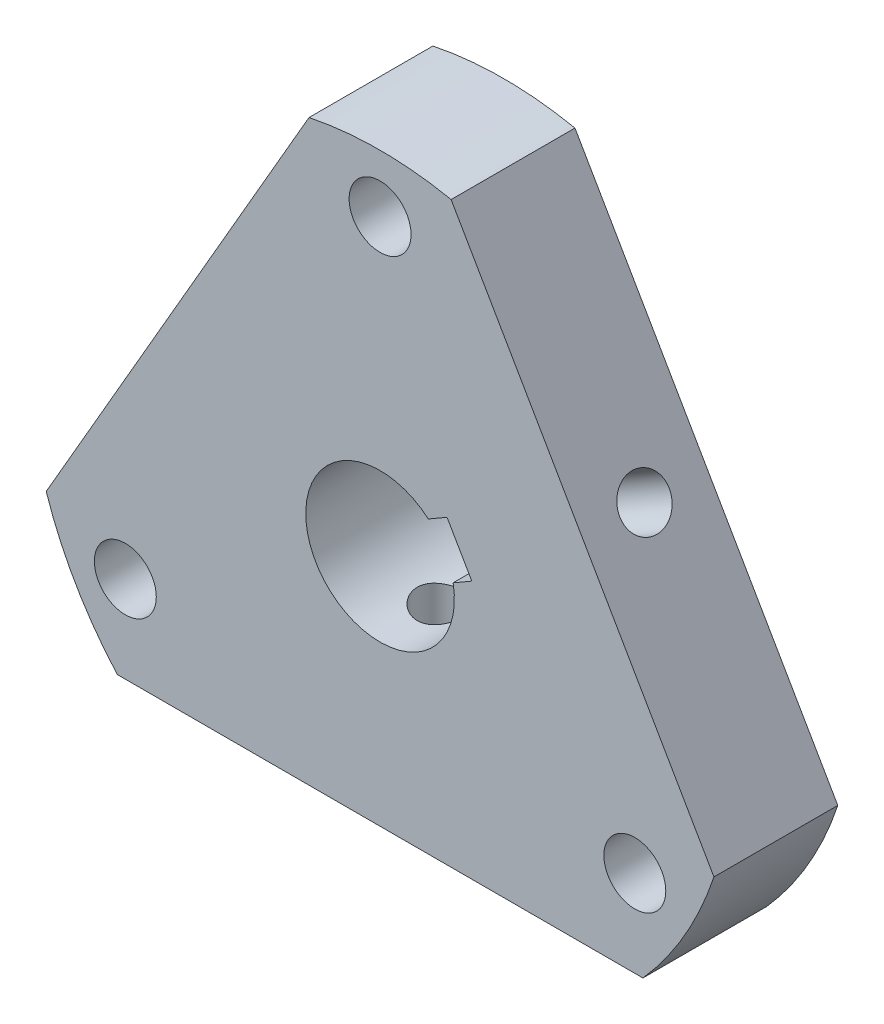
ISO-10303-21;
HEADER;
FILE_DESCRIPTION(('STEP AP214'),'2;1');
FILE_NAME('part.step','',(''),(''),'','','');
FILE_SCHEMA(('AUTOMOTIVE_DESIGN { 1 0 10303 214 1 1 1 1 }'));
ENDSEC;
DATA;
#1=APPLICATION_CONTEXT('core data for automotive mechanical design processes');
#2=APPLICATION_PROTOCOL_DEFINITION('international standard','automotive_design',2000,#1);
#3=PRODUCT_CONTEXT('',#1,'mechanical');
#4=PRODUCT('Part','Part','',(#3));
#5=PRODUCT_RELATED_PRODUCT_CATEGORY('part','',(#4));
#6=PRODUCT_DEFINITION_FORMATION('','',#4);
#7=PRODUCT_DEFINITION_CONTEXT('part definition',#1,'design');
#8=PRODUCT_DEFINITION('design','',#6,#7);
#9=PRODUCT_DEFINITION_SHAPE('','',#8);
#10=(LENGTH_UNIT() NAMED_UNIT(*) SI_UNIT(.MILLI.,.METRE.));
#11=(NAMED_UNIT(*) PLANE_ANGLE_UNIT() SI_UNIT($,.RADIAN.));
#12=(NAMED_UNIT(*) SI_UNIT($,.STERADIAN.) SOLID_ANGLE_UNIT());
#13=UNCERTAINTY_MEASURE_WITH_UNIT(LENGTH_MEASURE(1.E-05),#10,'distance_accuracy_value','');
#14=(GEOMETRIC_REPRESENTATION_CONTEXT(3) GLOBAL_UNCERTAINTY_ASSIGNED_CONTEXT((#13)) GLOBAL_UNIT_ASSIGNED_CONTEXT((#10,
#11,#12)) REPRESENTATION_CONTEXT('',''));
#15=CARTESIAN_POINT('',(0.,0.,0.));
#16=DIRECTION('',(0.,0.,1.));
#17=DIRECTION('',(1.,0.,0.));
#18=AXIS2_PLACEMENT_3D('',#15,#16,#17);
#19=CARTESIAN_POINT('',(6.40858798800485,3.7,10.));
#20=DIRECTION('',(0.866025403784439,0.5,0.));
#21=DIRECTION('',(-0.5,0.866025403784439,0.));
#22=AXIS2_PLACEMENT_3D('',#19,#20,#21);
#23=PLANE('',#22);
#24=DIRECTION('',(0.,0.,-1.));
#25=VECTOR('',#24,1.);
#26=CARTESIAN_POINT('',(5.40858798800485,5.43205080756888,10.));
#27=LINE('',#26,#25);
#28=CARTESIAN_POINT('',(5.40858798800485,5.43205080756888,10.));
#29=VERTEX_POINT('',#28);
#30=CARTESIAN_POINT('',(5.40858798800485,5.43205080756888,5.));
#31=VERTEX_POINT('',#30);
#32=EDGE_CURVE('E203',#29,#31,#27,.T.);
#33=ORIENTED_EDGE('',*,*,#32,.T.);
#34=CARTESIAN_POINT('',(6.40858798800485,3.7,5.));
#35=DIRECTION('',(0.866025403784439,0.5,0.));
#36=DIRECTION('',(-0.5,0.866025403784439,0.));
#37=AXIS2_PLACEMENT_3D('',#34,#35,#36);
#38=CIRCLE('',#37,2.);
#39=CARTESIAN_POINT('',(7.40858798800485,1.96794919243112,5.));
#40=VERTEX_POINT('',#39);
#41=EDGE_CURVE('E55',#31,#40,#38,.T.);
#42=ORIENTED_EDGE('',*,*,#41,.T.);
#43=DIRECTION('',(0.,0.,-1.));
#44=VECTOR('',#43,1.);
#45=CARTESIAN_POINT('',(7.40858798800485,1.96794919243112,10.));
#46=LINE('',#45,#44);
#47=CARTESIAN_POINT('',(7.40858798800485,1.96794919243112,10.));
#48=VERTEX_POINT('',#47);
#49=EDGE_CURVE('E199',#48,#40,#46,.T.);
#50=ORIENTED_EDGE('',*,*,#49,.F.);
#51=DIRECTION('',(0.5,-0.866025403784439,0.));
#52=VECTOR('',#51,1.);
#53=CARTESIAN_POINT('',(6.40858798800485,3.7,10.));
#54=LINE('',#53,#52);
#55=EDGE_CURVE('E230',#29,#48,#54,.T.);
#56=ORIENTED_EDGE('',*,*,#55,.F.);
#57=EDGE_LOOP('',(#33,#42,#50,#56));
#58=FACE_BOUND('',#57,.T.);
#59=ADVANCED_FACE('F35',(#58),#23,.F.);
#60=CARTESIAN_POINT('',(16.3462294964313,9.43749999999999,10.));
#61=DIRECTION('',(-0.866025403784439,-0.5,0.));
#62=DIRECTION('',(0.5,-0.866025403784439,0.));
#63=AXIS2_PLACEMENT_3D('',#60,#61,#62);
#64=PLANE('',#63);
#65=CARTESIAN_POINT('',(16.3462294964313,9.4375,5.));
#66=DIRECTION('',(0.866025403784439,0.5,0.));
#67=DIRECTION('',(-0.5,0.866025403784439,0.));
#68=AXIS2_PLACEMENT_3D('',#65,#66,#67);
#69=CIRCLE('',#68,2.);
#70=CARTESIAN_POINT('',(15.3462294964313,11.1695508075689,5.));
#71=VERTEX_POINT('',#70);
#72=EDGE_CURVE('E259',#71,#71,#69,.T.);
#73=ORIENTED_EDGE('',*,*,#72,.F.);
#74=EDGE_LOOP('',(#73));
#75=FACE_BOUND('',#74,.T.);
#76=DIRECTION('',(-0.5,0.866025403784439,0.));
#77=VECTOR('',#76,1.);
#78=CARTESIAN_POINT('',(16.3462294964313,9.43749999999999,0.));
#79=LINE('',#78,#77);
#80=CARTESIAN_POINT('',(26.9562998896945,-8.93968099301414,0.));
#81=VERTEX_POINT('',#80);
#82=CARTESIAN_POINT('',(5.7361591031681,27.8146809930141,0.));
#83=VERTEX_POINT('',#82);
#84=EDGE_CURVE('E182',#81,#83,#79,.T.);
#85=ORIENTED_EDGE('',*,*,#84,.T.);
#86=DIRECTION('',(0.,0.,-1.));
#87=VECTOR('',#86,1.);
#88=CARTESIAN_POINT('',(5.7361591031681,27.8146809930141,10.));
#89=LINE('',#88,#87);
#90=CARTESIAN_POINT('',(5.7361591031681,27.8146809930141,10.));
#91=VERTEX_POINT('',#90);
#92=EDGE_CURVE('E11',#91,#83,#89,.T.);
#93=ORIENTED_EDGE('',*,*,#92,.F.);
#94=DIRECTION('',(-0.5,0.866025403784439,0.));
#95=VECTOR('',#94,1.);
#96=CARTESIAN_POINT('',(16.3462294964313,9.43749999999999,10.));
#97=LINE('',#96,#95);
#98=CARTESIAN_POINT('',(26.9562998896945,-8.93968099301414,10.));
#99=VERTEX_POINT('',#98);
#100=EDGE_CURVE('E246',#99,#91,#97,.T.);
#101=ORIENTED_EDGE('',*,*,#100,.F.);
#102=DIRECTION('',(0.,0.,-1.));
#103=VECTOR('',#102,1.);
#104=CARTESIAN_POINT('',(26.9562998896945,-8.93968099301414,10.));
#105=LINE('',#104,#103);
#106=EDGE_CURVE('E191',#99,#81,#105,.T.);
#107=ORIENTED_EDGE('',*,*,#106,.T.);
#108=EDGE_LOOP('',(#85,#93,#101,#107));
#109=FACE_BOUND('',#108,.T.);
#110=ADVANCED_FACE('F279',(#75,#109),#64,.F.);
#111=CARTESIAN_POINT('',(0.,0.,10.));
#112=DIRECTION('',(0.,0.,-1.));
#113=DIRECTION('',(-1.,0.,0.));
#114=AXIS2_PLACEMENT_3D('',#111,#112,#113);
#115=CYLINDRICAL_SURFACE('',#114,28.4);
#116=CARTESIAN_POINT('',(0.,0.,0.));
#117=DIRECTION('',(0.,0.,1.));
#118=DIRECTION('',(1.,0.,0.));
#119=AXIS2_PLACEMENT_3D('',#116,#117,#118);
#120=CIRCLE('',#119,28.4);
#121=CARTESIAN_POINT('',(-5.7361591031681,27.8146809930141,0.));
#122=VERTEX_POINT('',#121);
#123=EDGE_CURVE('E185',#83,#122,#120,.T.);
#124=ORIENTED_EDGE('',*,*,#123,.T.);
#125=DIRECTION('',(0.,0.,-1.));
#126=VECTOR('',#125,1.);
#127=CARTESIAN_POINT('',(-5.7361591031681,27.8146809930141,10.));
#128=LINE('',#127,#126);
#129=CARTESIAN_POINT('',(-5.7361591031681,27.8146809930141,10.));
#130=VERTEX_POINT('',#129);
#131=EDGE_CURVE('E48',#130,#122,#128,.T.);
#132=ORIENTED_EDGE('',*,*,#131,.F.);
#133=CARTESIAN_POINT('',(0.,0.,10.));
#134=DIRECTION('',(0.,0.,1.));
#135=DIRECTION('',(1.,0.,0.));
#136=AXIS2_PLACEMENT_3D('',#133,#134,#135);
#137=CIRCLE('',#136,28.4);
#138=EDGE_CURVE('E145',#91,#130,#137,.T.);
#139=ORIENTED_EDGE('',*,*,#138,.F.);
#140=ORIENTED_EDGE('',*,*,#92,.T.);
#141=EDGE_LOOP('',(#124,#132,#139,#140));
#142=FACE_BOUND('',#141,.T.);
#143=ADVANCED_FACE('F251',(#142),#115,.T.);
#144=CARTESIAN_POINT('',(-16.3462294964313,9.4375,10.));
#145=DIRECTION('',(0.866025403784439,-0.5,0.));
#146=DIRECTION('',(0.5,0.866025403784439,0.));
#147=AXIS2_PLACEMENT_3D('',#144,#145,#146);
#148=PLANE('',#147);
#149=DIRECTION('',(-0.5,-0.866025403784439,0.));
#150=VECTOR('',#149,1.);
#151=CARTESIAN_POINT('',(-16.3462294964313,9.4375,0.));
#152=LINE('',#151,#150);
#153=CARTESIAN_POINT('',(-26.9562998896945,-8.93968099301413,0.));
#154=VERTEX_POINT('',#153);
#155=EDGE_CURVE('E187',#122,#154,#152,.T.);
#156=ORIENTED_EDGE('',*,*,#155,.T.);
#157=DIRECTION('',(0.,0.,-1.));
#158=VECTOR('',#157,1.);
#159=CARTESIAN_POINT('',(-26.9562998896945,-8.93968099301413,10.));
#160=LINE('',#159,#158);
#161=CARTESIAN_POINT('',(-26.9562998896945,-8.93968099301413,10.));
#162=VERTEX_POINT('',#161);
#163=EDGE_CURVE('E153',#162,#154,#160,.T.);
#164=ORIENTED_EDGE('',*,*,#163,.F.);
#165=DIRECTION('',(-0.5,-0.866025403784439,0.));
#166=VECTOR('',#165,1.);
#167=CARTESIAN_POINT('',(-16.3462294964313,9.4375,10.));
#168=LINE('',#167,#166);
#169=EDGE_CURVE('E140',#130,#162,#168,.T.);
#170=ORIENTED_EDGE('',*,*,#169,.F.);
#171=ORIENTED_EDGE('',*,*,#131,.T.);
#172=EDGE_LOOP('',(#156,#164,#170,#171));
#173=FACE_BOUND('',#172,.T.);
#174=ADVANCED_FACE('F254',(#173),#148,.F.);
#175=CARTESIAN_POINT('',(-21.2201407865264,-18.875,0.));
#176=VERTEX_POINT('',#175);
#177=EDGE_CURVE('E150',#154,#176,#120,.T.);
#178=ORIENTED_EDGE('',*,*,#177,.T.);
#179=DIRECTION('',(0.,0.,-1.));
#180=VECTOR('',#179,1.);
#181=CARTESIAN_POINT('',(-21.2201407865264,-18.875,10.));
#182=LINE('',#181,#180);
#183=CARTESIAN_POINT('',(-21.2201407865264,-18.875,10.));
#184=VERTEX_POINT('',#183);
#185=EDGE_CURVE('E147',#184,#176,#182,.T.);
#186=ORIENTED_EDGE('',*,*,#185,.F.);
#187=EDGE_CURVE('E133',#162,#184,#137,.T.);
#188=ORIENTED_EDGE('',*,*,#187,.F.);
#189=ORIENTED_EDGE('',*,*,#163,.T.);
#190=EDGE_LOOP('',(#178,#186,#188,#189));
#191=FACE_BOUND('',#190,.T.);
#192=ADVANCED_FACE('F148',(#191),#115,.T.);
#193=CARTESIAN_POINT('',(0.,-18.875,10.));
#194=DIRECTION('',(0.,1.,0.));
#195=DIRECTION('',(-1.,0.,0.));
#196=AXIS2_PLACEMENT_3D('',#193,#194,#195);
#197=PLANE('',#196);
#198=CARTESIAN_POINT('',(0.,-18.875,5.));
#199=DIRECTION('',(0.,-1.,0.));
#200=DIRECTION('',(1.,0.,0.));
#201=AXIS2_PLACEMENT_3D('',#198,#199,#200);
#202=CIRCLE('',#201,2.);
#203=CARTESIAN_POINT('',(2.,-18.875,5.));
#204=VERTEX_POINT('',#203);
#205=EDGE_CURVE('E262',#204,#204,#202,.T.);
#206=ORIENTED_EDGE('',*,*,#205,.F.);
#207=EDGE_LOOP('',(#206));
#208=FACE_BOUND('',#207,.T.);
#209=DIRECTION('',(1.,0.,0.));
#210=VECTOR('',#209,1.);
#211=CARTESIAN_POINT('',(0.,-18.875,0.));
#212=LINE('',#211,#210);
#213=CARTESIAN_POINT('',(21.2201407865264,-18.875,0.));
#214=VERTEX_POINT('',#213);
#215=EDGE_CURVE('E189',#176,#214,#212,.T.);
#216=ORIENTED_EDGE('',*,*,#215,.T.);
#217=DIRECTION('',(0.,0.,-1.));
#218=VECTOR('',#217,1.);
#219=CARTESIAN_POINT('',(21.2201407865264,-18.875,10.));
#220=LINE('',#219,#218);
#221=CARTESIAN_POINT('',(21.2201407865264,-18.875,10.));
#222=VERTEX_POINT('',#221);
#223=EDGE_CURVE('E154',#222,#214,#220,.T.);
#224=ORIENTED_EDGE('',*,*,#223,.F.);
#225=DIRECTION('',(1.,0.,0.));
#226=VECTOR('',#225,1.);
#227=CARTESIAN_POINT('',(0.,-18.875,10.));
#228=LINE('',#227,#226);
#229=EDGE_CURVE('E137',#184,#222,#228,.T.);
#230=ORIENTED_EDGE('',*,*,#229,.F.);
#231=ORIENTED_EDGE('',*,*,#185,.T.);
#232=EDGE_LOOP('',(#216,#224,#230,#231));
#233=FACE_BOUND('',#232,.T.);
#234=ADVANCED_FACE('F156',(#208,#233),#197,.F.);
#235=CARTESIAN_POINT('',(0.,0.,10.));
#236=DIRECTION('',(0.,0.,-1.));
#237=DIRECTION('',(-1.,0.,0.));
#238=AXIS2_PLACEMENT_3D('',#235,#236,#237);
#239=CYLINDRICAL_SURFACE('',#238,6.);
#240=CARTESIAN_POINT('',(2.,-5.65685424949238,5.));
#241=CARTESIAN_POINT('',(2.00000051589543,-5.65685389060868,4.89106365032786));
#242=CARTESIAN_POINT('',(1.99106956737105,-5.66003538581715,4.78213040035282));
#243=CARTESIAN_POINT('',(1.95570226337762,-5.6723514816251,4.5674911580115));
#244=CARTESIAN_POINT('',(1.9292630243368,-5.68148706284377,4.46178570025506));
#245=CARTESIAN_POINT('',(1.85991097136981,-5.70456407377583,4.25674621400542));
#246=CARTESIAN_POINT('',(1.81703044280649,-5.71849607942644,4.15740014111457));
#247=CARTESIAN_POINT('',(1.71612325688276,-5.74958244020649,3.96727990290408));
#248=CARTESIAN_POINT('',(1.65809325772037,-5.76673750607225,3.87650763489274));
#249=CARTESIAN_POINT('',(1.52610229288576,-5.80308978814946,3.70256007532337));
#250=CARTESIAN_POINT('',(1.45164868275584,-5.82233789689288,3.61976914265654));
#251=CARTESIAN_POINT('',(1.28997533442879,-5.86027729602006,3.46758639755072));
#252=CARTESIAN_POINT('',(1.20275355010475,-5.87896849657923,3.39819673683526));
#253=CARTESIAN_POINT('',(1.01520901593002,-5.91427733843598,3.27304220534081));
#254=CARTESIAN_POINT('',(0.914603822449052,-5.93082815403211,3.21768005876408));
#255=CARTESIAN_POINT('',(0.704862445974949,-5.95939173541966,3.12481682974498));
#256=CARTESIAN_POINT('',(0.595728571374425,-5.97140572406004,3.08731093364619));
#257=CARTESIAN_POINT('',(0.37605763486699,-5.98918150863813,3.03252829073521));
#258=CARTESIAN_POINT('',(0.265701509705938,-5.99514629555118,3.01459310748599));
#259=CARTESIAN_POINT('',(0.0433957496481807,-6.00087216436496,2.99736741327868));
#260=CARTESIAN_POINT('',(-0.068553467087791,-6.00063484525791,2.99807209669518));
#261=CARTESIAN_POINT('',(-0.286207030387628,-5.99412079237463,3.01768850913206));
#262=CARTESIAN_POINT('',(-0.391984097183312,-5.98808129510235,3.03588505694898));
#263=CARTESIAN_POINT('',(-0.598886877644342,-5.97093934679463,3.08878596196095));
#264=CARTESIAN_POINT('',(-0.70001227555843,-5.95983655262364,3.12349143795965));
#265=CARTESIAN_POINT('',(-0.896304949683944,-5.93351340586449,3.20884263461212));
#266=CARTESIAN_POINT('',(-0.991376441937688,-5.91824085048031,3.25969187709302));
#267=CARTESIAN_POINT('',(-1.17184865105464,-5.88516786077838,3.37571941089731));
#268=CARTESIAN_POINT('',(-1.25724666877068,-5.86736672402934,3.44090168665526));
#269=CARTESIAN_POINT('',(-1.42020173310261,-5.83012383699793,3.5873487869194));
#270=CARTESIAN_POINT('',(-1.49720031413054,-5.81064430337755,3.66922631568296));
#271=CARTESIAN_POINT('',(-1.63655451919635,-5.77294670497801,3.84489745145324));
#272=CARTESIAN_POINT('',(-1.69890788656308,-5.75472883491231,3.93869289145609));
#273=CARTESIAN_POINT('',(-1.80797491007148,-5.72141050242225,4.13730725120688));
#274=CARTESIAN_POINT('',(-1.85445292724268,-5.70635818569496,4.24226426263555));
#275=CARTESIAN_POINT('',(-1.92888638653867,-5.6816330164877,4.45914278842883));
#276=CARTESIAN_POINT('',(-1.95684959149499,-5.67195790974185,4.57106136241249));
#277=CARTESIAN_POINT('',(-1.99232256419504,-5.6595927263117,4.79327671082315));
#278=CARTESIAN_POINT('',(-2.00069819101527,-5.65660720637512,4.90341884949731));
#279=CARTESIAN_POINT('',(-1.99921087781944,-5.65713344118369,5.12355229822821));
#280=CARTESIAN_POINT('',(-1.98935125045353,-5.66064401583629,5.23354363204798));
#281=CARTESIAN_POINT('',(-1.95245130310462,-5.67347236180599,5.44631393142382));
#282=CARTESIAN_POINT('',(-1.92601278796137,-5.68258650881681,5.54921086030168));
#283=CARTESIAN_POINT('',(-1.85742772512093,-5.70537107342046,5.74908721247837));
#284=CARTESIAN_POINT('',(-1.81527839272684,-5.71904229869679,5.84606558318156));
#285=CARTESIAN_POINT('',(-1.71494868147787,-5.74993755191574,6.03476084169399));
#286=CARTESIAN_POINT('',(-1.65630223671699,-5.76726051331257,6.1262132852836));
#287=CARTESIAN_POINT('',(-1.52517126111512,-5.80331537461931,6.29829210476744));
#288=CARTESIAN_POINT('',(-1.45268265099756,-5.82204768887589,6.37891527732244));
#289=CARTESIAN_POINT('',(-1.29178341180065,-5.85990077275698,6.53105596818128));
#290=CARTESIAN_POINT('',(-1.20277454109331,-5.87899687155793,6.6019487800377));
#291=CARTESIAN_POINT('',(-1.01365458280051,-5.91453703226218,6.72783228469608));
#292=CARTESIAN_POINT('',(-0.913543889729105,-5.9309811883539,6.78282354232485));
#293=CARTESIAN_POINT('',(-0.705559724864592,-5.95928811621206,6.87484020972343));
#294=CARTESIAN_POINT('',(-0.597742246642394,-5.97118060009062,6.91198255429613));
#295=CARTESIAN_POINT('',(-0.376916931692034,-5.98917221675549,6.96745548412021));
#296=CARTESIAN_POINT('',(-0.26391098390778,-5.99527344068038,6.985792859761));
#297=CARTESIAN_POINT('',(-0.0416306717200825,-6.00083726472513,7.00252415521128));
#298=CARTESIAN_POINT('',(0.0675694478400364,-6.00059840178878,7.00181490786476));
#299=CARTESIAN_POINT('',(0.284222290000347,-5.99424393038796,6.98268538370718));
#300=CARTESIAN_POINT('',(0.391675153638113,-5.98812879867152,6.96426654369446));
#301=CARTESIAN_POINT('',(0.600084238864117,-5.97081829908825,6.91083553084808));
#302=CARTESIAN_POINT('',(0.701116541825578,-5.95970516722297,6.87609156929413));
#303=CARTESIAN_POINT('',(0.895956701879591,-5.9335432140899,6.79124493780569));
#304=CARTESIAN_POINT('',(0.989763248284864,-5.91849368096033,6.74113948960597));
#305=CARTESIAN_POINT('',(1.17126803261757,-5.88531737655762,6.62486097579599));
#306=CARTESIAN_POINT('',(1.25861250311521,-5.86709744983853,6.55816262923672));
#307=CARTESIAN_POINT('',(1.42116205254485,-5.82985977583759,6.41148521768761));
#308=CARTESIAN_POINT('',(1.49636324324918,-5.81084177546194,6.33150191547455));
#309=CARTESIAN_POINT('',(1.63548361766623,-5.77326559651196,6.1567812888261));
#310=CARTESIAN_POINT('',(1.6988459319958,-5.75475455977261,6.06158897804672));
#311=CARTESIAN_POINT('',(1.80862868660223,-5.72120386646031,5.86133114619444));
#312=CARTESIAN_POINT('',(1.85505355363895,-5.70616330322499,5.75626821394067));
#313=CARTESIAN_POINT('',(1.92768765640833,-5.68202668413029,5.54407635196874));
#314=CARTESIAN_POINT('',(1.95471581829904,-5.67269265714365,5.43725547294927));
#315=CARTESIAN_POINT('',(1.99086864029853,-5.66010767079037,5.2202878990666));
#316=CARTESIAN_POINT('',(1.99999947839319,-5.65685461234922,5.11014236517858));
#317=CARTESIAN_POINT('',(2.,-5.65685424949238,5.));
#318=B_SPLINE_CURVE_WITH_KNOTS('',3,(#240,#241,#242,#243,#244,#245,#246,#247,#248,#249,#250,
#251,#252,#253,#254,#255,#256,#257,#258,#259,#260,#261,#262,#263,#264,#265,#266,#267,#268,#269,
#270,#271,#272,#273,#274,#275,#276,#277,#278,#279,#280,#281,#282,#283,#284,#285,#286,#287,#288,
#289,#290,#291,#292,#293,#294,#295,#296,#297,#298,#299,#300,#301,#302,#303,#304,#305,#306,#307,
#308,#309,#310,#311,#312,#313,#314,#315,#316,#317),.UNSPECIFIED.,.T.,.F.,(4,2,2,2,2,2,2,2,2,2,2,
2,2,2,2,2,2,2,2,2,2,2,2,2,2,2,2,2,2,2,2,2,2,2,2,2,2,2,4),(0.,0.326401169598712,
0.652856110030327,0.978673255001655,1.30456233237088,1.64202674855136,1.97954530343976,
2.32587012287314,2.67210152773578,3.00628637529868,3.34038506604654,3.66138009651138,
3.98239688378473,4.3076330972067,4.63295983748044,4.97360348727835,5.31429959224212,
5.65985279686111,6.00526102713231,6.33508582728879,6.66485071674467,6.98328791537552,
7.30178158293891,7.6303771547143,7.95906971324255,8.30357616342185,8.64807037515065,
8.99027582381703,9.33235766008313,9.65836169355271,9.98433928019562,10.3051391208086,
10.6259970152649,10.9587103904127,11.2915300886526,11.6373780547229,11.9831355653373,
12.3132642432538,12.6432789438093),.UNSPECIFIED.);
#319=CARTESIAN_POINT('',(2.,-5.65685424949238,5.));
#320=VERTEX_POINT('',#319);
#321=EDGE_CURVE('E40',#320,#320,#318,.T.);
#322=ORIENTED_EDGE('',*,*,#321,.F.);
#323=EDGE_LOOP('',(#322));
#324=FACE_BOUND('',#323,.T.);
#325=CARTESIAN_POINT('',(0.,0.,0.));
#326=DIRECTION('',(0.,0.,1.));
#327=DIRECTION('',(1.,0.,0.));
#328=AXIS2_PLACEMENT_3D('',#325,#326,#327);
#329=CIRCLE('',#328,6.);
#330=CARTESIAN_POINT('',(3.89897948556636,4.56047793231507,0.));
#331=VERTEX_POINT('',#330);
#332=CARTESIAN_POINT('',(5.89897948556636,1.09637631717731,0.));
#333=VERTEX_POINT('',#332);
#334=EDGE_CURVE('E161',#331,#333,#329,.T.);
#335=ORIENTED_EDGE('',*,*,#334,.F.);
#336=DIRECTION('',(0.,0.,-1.));
#337=VECTOR('',#336,1.);
#338=CARTESIAN_POINT('',(3.89897948556636,4.56047793231507,10.));
#339=LINE('',#338,#337);
#340=CARTESIAN_POINT('',(3.89897948556636,4.56047793231507,10.));
#341=VERTEX_POINT('',#340);
#342=EDGE_CURVE('E111',#341,#331,#339,.T.);
#343=ORIENTED_EDGE('',*,*,#342,.F.);
#344=CARTESIAN_POINT('',(0.,0.,10.));
#345=DIRECTION('',(0.,0.,1.));
#346=DIRECTION('',(1.,0.,0.));
#347=AXIS2_PLACEMENT_3D('',#344,#345,#346);
#348=CIRCLE('',#347,6.);
#349=CARTESIAN_POINT('',(5.89897948556636,1.09637631717731,10.));
#350=VERTEX_POINT('',#349);
#351=EDGE_CURVE('E217',#341,#350,#348,.T.);
#352=ORIENTED_EDGE('',*,*,#351,.T.);
#353=DIRECTION('',(0.,0.,-1.));
#354=VECTOR('',#353,1.);
#355=CARTESIAN_POINT('',(5.89897948556636,1.09637631717731,10.));
#356=LINE('',#355,#354);
#357=EDGE_CURVE('E158',#350,#333,#356,.T.);
#358=ORIENTED_EDGE('',*,*,#357,.T.);
#359=EDGE_LOOP('',(#335,#343,#352,#358));
#360=FACE_BOUND('',#359,.T.);
#361=ADVANCED_FACE('F37',(#324,#360),#239,.F.);
#362=CARTESIAN_POINT('',(-1.,1.73205080756888,10.));
#363=DIRECTION('',(-0.5,0.866025403784439,0.));
#364=DIRECTION('',(-0.866025403784439,-0.5,0.));
#365=AXIS2_PLACEMENT_3D('',#362,#363,#364);
#366=PLANE('',#365);
#367=ORIENTED_EDGE('',*,*,#342,.T.);
#368=DIRECTION('',(0.866025403784439,0.5,0.));
#369=VECTOR('',#368,1.);
#370=CARTESIAN_POINT('',(-1.,1.73205080756888,0.));
#371=LINE('',#370,#369);
#372=CARTESIAN_POINT('',(5.40858798800485,5.43205080756888,0.));
#373=VERTEX_POINT('',#372);
#374=EDGE_CURVE('E164',#331,#373,#371,.T.);
#375=ORIENTED_EDGE('',*,*,#374,.T.);
#376=EDGE_CURVE('E202',#31,#373,#27,.T.);
#377=ORIENTED_EDGE('',*,*,#376,.F.);
#378=ORIENTED_EDGE('',*,*,#32,.F.);
#379=DIRECTION('',(0.866025403784439,0.5,0.));
#380=VECTOR('',#379,1.);
#381=CARTESIAN_POINT('',(-1.,1.73205080756888,10.));
#382=LINE('',#381,#380);
#383=EDGE_CURVE('E211',#341,#29,#382,.T.);
#384=ORIENTED_EDGE('',*,*,#383,.F.);
#385=EDGE_LOOP('',(#367,#375,#377,#378,#384));
#386=FACE_BOUND('',#385,.T.);
#387=ADVANCED_FACE('F207',(#386),#366,.F.);
#388=CARTESIAN_POINT('',(7.40858798800485,1.96794919243112,0.));
#389=VERTEX_POINT('',#388);
#390=EDGE_CURVE('E198',#40,#389,#46,.T.);
#391=ORIENTED_EDGE('',*,*,#390,.F.);
#392=EDGE_CURVE('E227',#40,#31,#38,.T.);
#393=ORIENTED_EDGE('',*,*,#392,.T.);
#394=ORIENTED_EDGE('',*,*,#376,.T.);
#395=DIRECTION('',(0.5,-0.866025403784439,0.));
#396=VECTOR('',#395,1.);
#397=CARTESIAN_POINT('',(6.40858798800485,3.7,0.));
#398=LINE('',#397,#396);
#399=EDGE_CURVE('E167',#373,#389,#398,.T.);
#400=ORIENTED_EDGE('',*,*,#399,.T.);
#401=EDGE_LOOP('',(#391,#393,#394,#400));
#402=FACE_BOUND('',#401,.T.);
#403=ADVANCED_FACE('F226',(#402),#23,.F.);
#404=CARTESIAN_POINT('',(0.,23.75,10.));
#405=DIRECTION('',(0.,0.,-1.));
#406=DIRECTION('',(-1.,0.,0.));
#407=AXIS2_PLACEMENT_3D('',#404,#405,#406);
#408=CYLINDRICAL_SURFACE('',#407,2.5);
#409=CARTESIAN_POINT('',(0.,23.75,10.));
#410=DIRECTION('',(0.,0.,1.));
#411=DIRECTION('',(1.,0.,0.));
#412=AXIS2_PLACEMENT_3D('',#409,#410,#411);
#413=CIRCLE('',#412,2.5);
#414=CARTESIAN_POINT('',(2.5,23.75,10.));
#415=VERTEX_POINT('',#414);
#416=EDGE_CURVE('E243',#415,#415,#413,.T.);
#417=ORIENTED_EDGE('',*,*,#416,.T.);
#418=EDGE_LOOP('',(#417));
#419=FACE_BOUND('',#418,.T.);
#420=CARTESIAN_POINT('',(0.,23.75,0.));
#421=DIRECTION('',(0.,0.,1.));
#422=DIRECTION('',(1.,0.,0.));
#423=AXIS2_PLACEMENT_3D('',#420,#421,#422);
#424=CIRCLE('',#423,2.5);
#425=CARTESIAN_POINT('',(2.5,23.75,0.));
#426=VERTEX_POINT('',#425);
#427=EDGE_CURVE('E179',#426,#426,#424,.T.);
#428=ORIENTED_EDGE('',*,*,#427,.F.);
#429=EDGE_LOOP('',(#428));
#430=FACE_BOUND('',#429,.T.);
#431=ADVANCED_FACE('F288',(#419,#430),#408,.F.);
#432=CARTESIAN_POINT('',(20.5681033398819,-11.8749999999991,10.));
#433=DIRECTION('',(0.,0.,-1.));
#434=DIRECTION('',(-1.,0.,0.));
#435=AXIS2_PLACEMENT_3D('',#432,#433,#434);
#436=CYLINDRICAL_SURFACE('',#435,2.5000000000013);
#437=CARTESIAN_POINT('',(20.5681033398819,-11.8749999999991,10.));
#438=DIRECTION('',(0.,0.,1.));
#439=DIRECTION('',(1.,0.,0.));
#440=AXIS2_PLACEMENT_3D('',#437,#438,#439);
#441=CIRCLE('',#440,2.5000000000013);
#442=CARTESIAN_POINT('',(23.0681033398832,-11.8749999999991,10.));
#443=VERTEX_POINT('',#442);
#444=EDGE_CURVE('E240',#443,#443,#441,.T.);
#445=ORIENTED_EDGE('',*,*,#444,.T.);
#446=EDGE_LOOP('',(#445));
#447=FACE_BOUND('',#446,.T.);
#448=CARTESIAN_POINT('',(20.5681033398819,-11.8749999999991,0.));
#449=DIRECTION('',(0.,0.,1.));
#450=DIRECTION('',(1.,0.,0.));
#451=AXIS2_PLACEMENT_3D('',#448,#449,#450);
#452=CIRCLE('',#451,2.5000000000013);
#453=CARTESIAN_POINT('',(23.0681033398832,-11.8749999999991,0.));
#454=VERTEX_POINT('',#453);
#455=EDGE_CURVE('E176',#454,#454,#452,.T.);
#456=ORIENTED_EDGE('',*,*,#455,.F.);
#457=EDGE_LOOP('',(#456));
#458=FACE_BOUND('',#457,.T.);
#459=ADVANCED_FACE('F292',(#447,#458),#436,.F.);
#460=CARTESIAN_POINT('',(-20.5681033398789,-11.8750000000009,10.));
#461=DIRECTION('',(0.,0.,-1.));
#462=DIRECTION('',(-1.,0.,0.));
#463=AXIS2_PLACEMENT_3D('',#460,#461,#462);
#464=CYLINDRICAL_SURFACE('',#463,2.50000000000192);
#465=CARTESIAN_POINT('',(-20.5681033398789,-11.8750000000009,10.));
#466=DIRECTION('',(0.,0.,1.));
#467=DIRECTION('',(1.,0.,0.));
#468=AXIS2_PLACEMENT_3D('',#465,#466,#467);
#469=CIRCLE('',#468,2.50000000000192);
#470=CARTESIAN_POINT('',(-18.068103339877,-11.8750000000009,10.));
#471=VERTEX_POINT('',#470);
#472=EDGE_CURVE('E233',#471,#471,#469,.T.);
#473=ORIENTED_EDGE('',*,*,#472,.T.);
#474=EDGE_LOOP('',(#473));
#475=FACE_BOUND('',#474,.T.);
#476=CARTESIAN_POINT('',(-20.5681033398789,-11.8750000000009,0.));
#477=DIRECTION('',(0.,0.,1.));
#478=DIRECTION('',(1.,0.,0.));
#479=AXIS2_PLACEMENT_3D('',#476,#477,#478);
#480=CIRCLE('',#479,2.50000000000192);
#481=CARTESIAN_POINT('',(-18.068103339877,-11.8750000000009,0.));
#482=VERTEX_POINT('',#481);
#483=EDGE_CURVE('E173',#482,#482,#480,.T.);
#484=ORIENTED_EDGE('',*,*,#483,.F.);
#485=EDGE_LOOP('',(#484));
#486=FACE_BOUND('',#485,.T.);
#487=ADVANCED_FACE('F298',(#475,#486),#464,.F.);
#488=CARTESIAN_POINT('',(1.,-1.73205080756888,10.));
#489=DIRECTION('',(-0.5,0.866025403784439,0.));
#490=DIRECTION('',(-0.866025403784439,-0.5,0.));
#491=AXIS2_PLACEMENT_3D('',#488,#489,#490);
#492=PLANE('',#491);
#493=ORIENTED_EDGE('',*,*,#49,.T.);
#494=ORIENTED_EDGE('',*,*,#390,.T.);
#495=DIRECTION('',(0.866025403784439,0.5,0.));
#496=VECTOR('',#495,1.);
#497=CARTESIAN_POINT('',(1.,-1.73205080756888,0.));
#498=LINE('',#497,#496);
#499=EDGE_CURVE('E170',#333,#389,#498,.T.);
#500=ORIENTED_EDGE('',*,*,#499,.F.);
#501=ORIENTED_EDGE('',*,*,#357,.F.);
#502=DIRECTION('',(0.866025403784439,0.5,0.));
#503=VECTOR('',#502,1.);
#504=CARTESIAN_POINT('',(1.,-1.73205080756888,10.));
#505=LINE('',#504,#503);
#506=EDGE_CURVE('E222',#350,#48,#505,.T.);
#507=ORIENTED_EDGE('',*,*,#506,.T.);
#508=EDGE_LOOP('',(#493,#494,#500,#501,#507));
#509=FACE_BOUND('',#508,.T.);
#510=ADVANCED_FACE('F221',(#509),#492,.T.);
#511=EDGE_CURVE('E103',#214,#81,#120,.T.);
#512=ORIENTED_EDGE('',*,*,#511,.T.);
#513=ORIENTED_EDGE('',*,*,#106,.F.);
#514=EDGE_CURVE('E64',#222,#99,#137,.T.);
#515=ORIENTED_EDGE('',*,*,#514,.F.);
#516=ORIENTED_EDGE('',*,*,#223,.T.);
#517=EDGE_LOOP('',(#512,#513,#515,#516));
#518=FACE_BOUND('',#517,.T.);
#519=ADVANCED_FACE('F307',(#518),#115,.T.);
#520=CARTESIAN_POINT('',(0.,0.,10.));
#521=DIRECTION('',(0.,0.,1.));
#522=DIRECTION('',(1.,0.,0.));
#523=AXIS2_PLACEMENT_3D('',#520,#521,#522);
#524=PLANE('',#523);
#525=ORIENTED_EDGE('',*,*,#351,.F.);
#526=ORIENTED_EDGE('',*,*,#383,.T.);
#527=ORIENTED_EDGE('',*,*,#55,.T.);
#528=ORIENTED_EDGE('',*,*,#506,.F.);
#529=EDGE_LOOP('',(#525,#526,#527,#528));
#530=FACE_BOUND('',#529,.T.);
#531=ORIENTED_EDGE('',*,*,#472,.F.);
#532=EDGE_LOOP('',(#531));
#533=FACE_BOUND('',#532,.T.);
#534=ORIENTED_EDGE('',*,*,#444,.F.);
#535=EDGE_LOOP('',(#534));
#536=FACE_BOUND('',#535,.T.);
#537=ORIENTED_EDGE('',*,*,#416,.F.);
#538=EDGE_LOOP('',(#537));
#539=FACE_BOUND('',#538,.T.);
#540=ORIENTED_EDGE('',*,*,#100,.T.);
#541=ORIENTED_EDGE('',*,*,#138,.T.);
#542=ORIENTED_EDGE('',*,*,#169,.T.);
#543=ORIENTED_EDGE('',*,*,#187,.T.);
#544=ORIENTED_EDGE('',*,*,#229,.T.);
#545=ORIENTED_EDGE('',*,*,#514,.T.);
#546=EDGE_LOOP('',(#540,#541,#542,#543,#544,#545));
#547=FACE_BOUND('',#546,.T.);
#548=ADVANCED_FACE('F135',(#530,#533,#536,#539,#547),#524,.T.);
#549=CARTESIAN_POINT('',(0.,0.,0.));
#550=DIRECTION('',(0.,0.,1.));
#551=DIRECTION('',(1.,0.,0.));
#552=AXIS2_PLACEMENT_3D('',#549,#550,#551);
#553=PLANE('',#552);
#554=ORIENTED_EDGE('',*,*,#334,.T.);
#555=ORIENTED_EDGE('',*,*,#499,.T.);
#556=ORIENTED_EDGE('',*,*,#399,.F.);
#557=ORIENTED_EDGE('',*,*,#374,.F.);
#558=EDGE_LOOP('',(#554,#555,#556,#557));
#559=FACE_BOUND('',#558,.T.);
#560=ORIENTED_EDGE('',*,*,#483,.T.);
#561=EDGE_LOOP('',(#560));
#562=FACE_BOUND('',#561,.T.);
#563=ORIENTED_EDGE('',*,*,#455,.T.);
#564=EDGE_LOOP('',(#563));
#565=FACE_BOUND('',#564,.T.);
#566=ORIENTED_EDGE('',*,*,#427,.T.);
#567=EDGE_LOOP('',(#566));
#568=FACE_BOUND('',#567,.T.);
#569=ORIENTED_EDGE('',*,*,#84,.F.);
#570=ORIENTED_EDGE('',*,*,#511,.F.);
#571=ORIENTED_EDGE('',*,*,#215,.F.);
#572=ORIENTED_EDGE('',*,*,#177,.F.);
#573=ORIENTED_EDGE('',*,*,#155,.F.);
#574=ORIENTED_EDGE('',*,*,#123,.F.);
#575=EDGE_LOOP('',(#569,#570,#571,#572,#573,#574));
#576=FACE_BOUND('',#575,.T.);
#577=ADVANCED_FACE('F214',(#559,#562,#565,#568,#576),#553,.F.);
#578=CARTESIAN_POINT('',(3.35584843966471,1.9375,5.));
#579=DIRECTION('',(0.866025403784439,0.5,0.));
#580=DIRECTION('',(-0.5,0.866025403784439,0.));
#581=AXIS2_PLACEMENT_3D('',#578,#579,#580);
#582=CYLINDRICAL_SURFACE('',#581,2.);
#583=ORIENTED_EDGE('',*,*,#72,.T.);
#584=EDGE_LOOP('',(#583));
#585=FACE_BOUND('',#584,.T.);
#586=ORIENTED_EDGE('',*,*,#392,.F.);
#587=ORIENTED_EDGE('',*,*,#41,.F.);
#588=EDGE_LOOP('',(#586,#587));
#589=FACE_BOUND('',#588,.T.);
#590=ADVANCED_FACE('F358',(#585,#589),#582,.F.);
#591=CARTESIAN_POINT('',(0.,-3.875,5.));
#592=DIRECTION('',(0.,-1.,0.));
#593=DIRECTION('',(1.,0.,0.));
#594=AXIS2_PLACEMENT_3D('',#591,#592,#593);
#595=CYLINDRICAL_SURFACE('',#594,2.);
#596=ORIENTED_EDGE('',*,*,#321,.T.);
#597=EDGE_LOOP('',(#596));
#598=FACE_BOUND('',#597,.T.);
#599=ORIENTED_EDGE('',*,*,#205,.T.);
#600=EDGE_LOOP('',(#599));
#601=FACE_BOUND('',#600,.T.);
#602=ADVANCED_FACE('F269',(#598,#601),#595,.F.);
#603=CLOSED_SHELL('',(#59,#110,#143,#174,#192,#234,#361,#387,#403,#431,#459,#487,#510,#519,#548,
#577,#590,#602));
#604=MANIFOLD_SOLID_BREP('B2',#603);
#605=ADVANCED_BREP_SHAPE_REPRESENTATION('',(#18,#604),#14);
#606=SHAPE_DEFINITION_REPRESENTATION(#9,#605);
ENDSEC;
END-ISO-10303-21;
